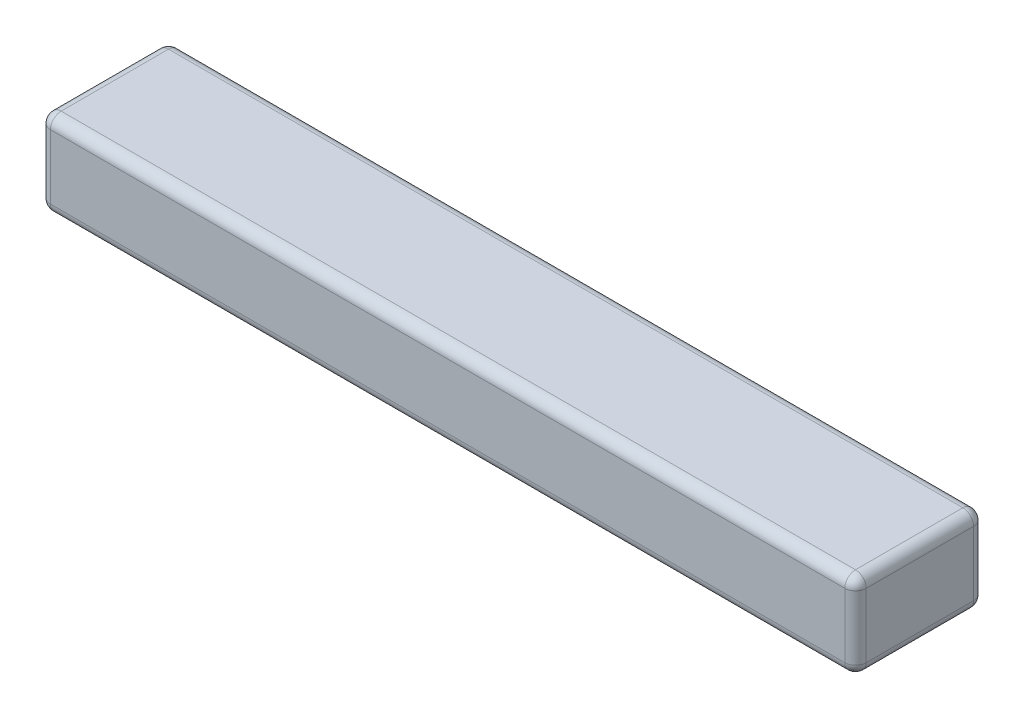
ISO-10303-21;
HEADER;
FILE_DESCRIPTION(('STEP AP214'),'2;1');
FILE_NAME('part.step','',(''),(''),'','','');
FILE_SCHEMA(('AUTOMOTIVE_DESIGN { 1 0 10303 214 1 1 1 1 }'));
ENDSEC;
DATA;
#1=APPLICATION_CONTEXT('core data for automotive mechanical design processes');
#2=APPLICATION_PROTOCOL_DEFINITION('international standard','automotive_design',2000,#1);
#3=PRODUCT_CONTEXT('',#1,'mechanical');
#4=PRODUCT('Part','Part','',(#3));
#5=PRODUCT_RELATED_PRODUCT_CATEGORY('part','',(#4));
#6=PRODUCT_DEFINITION_FORMATION('','',#4);
#7=PRODUCT_DEFINITION_CONTEXT('part definition',#1,'design');
#8=PRODUCT_DEFINITION('design','',#6,#7);
#9=PRODUCT_DEFINITION_SHAPE('','',#8);
#10=(LENGTH_UNIT() NAMED_UNIT(*) SI_UNIT(.MILLI.,.METRE.));
#11=(NAMED_UNIT(*) PLANE_ANGLE_UNIT() SI_UNIT($,.RADIAN.));
#12=(NAMED_UNIT(*) SI_UNIT($,.STERADIAN.) SOLID_ANGLE_UNIT());
#13=UNCERTAINTY_MEASURE_WITH_UNIT(LENGTH_MEASURE(1.E-05),#10,'distance_accuracy_value','');
#14=(GEOMETRIC_REPRESENTATION_CONTEXT(3) GLOBAL_UNCERTAINTY_ASSIGNED_CONTEXT((#13)) GLOBAL_UNIT_ASSIGNED_CONTEXT((#10,
#11,#12)) REPRESENTATION_CONTEXT('',''));
#15=CARTESIAN_POINT('',(0.,0.,0.));
#16=DIRECTION('',(0.,0.,1.));
#17=DIRECTION('',(1.,0.,0.));
#18=AXIS2_PLACEMENT_3D('',#15,#16,#17);
#19=CARTESIAN_POINT('',(190.,-20.,-30.));
#20=DIRECTION('',(0.,0.,1.));
#21=DIRECTION('',(1.,0.,0.));
#22=AXIS2_PLACEMENT_3D('',#19,#20,#21);
#23=PLANE('',#22);
#24=DIRECTION('',(0.,1.,0.));
#25=VECTOR('',#24,1.);
#26=CARTESIAN_POINT('',(185.,-20.,-30.));
#27=LINE('',#26,#25);
#28=CARTESIAN_POINT('',(185.,15.,-30.));
#29=VERTEX_POINT('',#28);
#30=CARTESIAN_POINT('',(185.,-15.,-30.));
#31=VERTEX_POINT('',#30);
#32=EDGE_CURVE('E175',#29,#31,#27,.F.);
#33=ORIENTED_EDGE('',*,*,#32,.T.);
#34=DIRECTION('',(-1.,0.,0.));
#35=VECTOR('',#34,1.);
#36=CARTESIAN_POINT('',(190.,-15.,-30.));
#37=LINE('',#36,#35);
#38=CARTESIAN_POINT('',(-185.,-15.,-30.));
#39=VERTEX_POINT('',#38);
#40=EDGE_CURVE('E180',#31,#39,#37,.T.);
#41=ORIENTED_EDGE('',*,*,#40,.T.);
#42=DIRECTION('',(0.,1.,0.));
#43=VECTOR('',#42,1.);
#44=CARTESIAN_POINT('',(-185.,20.,-30.));
#45=LINE('',#44,#43);
#46=CARTESIAN_POINT('',(-185.,15.,-30.));
#47=VERTEX_POINT('',#46);
#48=EDGE_CURVE('E177',#39,#47,#45,.T.);
#49=ORIENTED_EDGE('',*,*,#48,.T.);
#50=DIRECTION('',(-1.,0.,0.));
#51=VECTOR('',#50,1.);
#52=CARTESIAN_POINT('',(190.,15.,-30.));
#53=LINE('',#52,#51);
#54=EDGE_CURVE('E173',#47,#29,#53,.F.);
#55=ORIENTED_EDGE('',*,*,#54,.T.);
#56=EDGE_LOOP('',(#33,#41,#49,#55));
#57=FACE_BOUND('',#56,.T.);
#58=ADVANCED_FACE('F32',(#57),#23,.F.);
#59=CARTESIAN_POINT('',(190.,20.,30.));
#60=DIRECTION('',(0.,-1.,0.));
#61=DIRECTION('',(0.,0.,-1.));
#62=AXIS2_PLACEMENT_3D('',#59,#60,#61);
#63=PLANE('',#62);
#64=DIRECTION('',(0.,0.,1.));
#65=VECTOR('',#64,1.);
#66=CARTESIAN_POINT('',(185.,20.,30.));
#67=LINE('',#66,#65);
#68=CARTESIAN_POINT('',(185.,20.,25.));
#69=VERTEX_POINT('',#68);
#70=CARTESIAN_POINT('',(185.,20.,-25.));
#71=VERTEX_POINT('',#70);
#72=EDGE_CURVE('E184',#69,#71,#67,.F.);
#73=ORIENTED_EDGE('',*,*,#72,.T.);
#74=DIRECTION('',(-1.,0.,0.));
#75=VECTOR('',#74,1.);
#76=CARTESIAN_POINT('',(190.,20.,-25.));
#77=LINE('',#76,#75);
#78=CARTESIAN_POINT('',(-185.,20.,-25.));
#79=VERTEX_POINT('',#78);
#80=EDGE_CURVE('E189',#71,#79,#77,.T.);
#81=ORIENTED_EDGE('',*,*,#80,.T.);
#82=DIRECTION('',(0.,0.,1.));
#83=VECTOR('',#82,1.);
#84=CARTESIAN_POINT('',(-185.,20.,30.));
#85=LINE('',#84,#83);
#86=CARTESIAN_POINT('',(-185.,20.,25.));
#87=VERTEX_POINT('',#86);
#88=EDGE_CURVE('E186',#79,#87,#85,.T.);
#89=ORIENTED_EDGE('',*,*,#88,.T.);
#90=DIRECTION('',(-1.,0.,0.));
#91=VECTOR('',#90,1.);
#92=CARTESIAN_POINT('',(190.,20.,25.));
#93=LINE('',#92,#91);
#94=EDGE_CURVE('E182',#87,#69,#93,.F.);
#95=ORIENTED_EDGE('',*,*,#94,.T.);
#96=EDGE_LOOP('',(#73,#81,#89,#95));
#97=FACE_BOUND('',#96,.T.);
#98=ADVANCED_FACE('F286',(#97),#63,.F.);
#99=CARTESIAN_POINT('',(190.,-20.,30.));
#100=DIRECTION('',(0.,0.,-1.));
#101=DIRECTION('',(-1.,0.,0.));
#102=AXIS2_PLACEMENT_3D('',#99,#100,#101);
#103=PLANE('',#102);
#104=DIRECTION('',(0.,-1.,0.));
#105=VECTOR('',#104,1.);
#106=CARTESIAN_POINT('',(-185.,-20.,30.));
#107=LINE('',#106,#105);
#108=CARTESIAN_POINT('',(-185.,15.,30.));
#109=VERTEX_POINT('',#108);
#110=CARTESIAN_POINT('',(-185.,-15.,30.));
#111=VERTEX_POINT('',#110);
#112=EDGE_CURVE('E195',#109,#111,#107,.T.);
#113=ORIENTED_EDGE('',*,*,#112,.T.);
#114=DIRECTION('',(-1.,0.,0.));
#115=VECTOR('',#114,1.);
#116=CARTESIAN_POINT('',(190.,-15.,30.));
#117=LINE('',#116,#115);
#118=CARTESIAN_POINT('',(185.,-15.,30.));
#119=VERTEX_POINT('',#118);
#120=EDGE_CURVE('E198',#111,#119,#117,.F.);
#121=ORIENTED_EDGE('',*,*,#120,.T.);
#122=DIRECTION('',(0.,-1.,0.));
#123=VECTOR('',#122,1.);
#124=CARTESIAN_POINT('',(185.,-20.,30.));
#125=LINE('',#124,#123);
#126=CARTESIAN_POINT('',(185.,15.,30.));
#127=VERTEX_POINT('',#126);
#128=EDGE_CURVE('E193',#119,#127,#125,.F.);
#129=ORIENTED_EDGE('',*,*,#128,.T.);
#130=DIRECTION('',(-1.,0.,0.));
#131=VECTOR('',#130,1.);
#132=CARTESIAN_POINT('',(190.,15.,30.));
#133=LINE('',#132,#131);
#134=EDGE_CURVE('E191',#127,#109,#133,.T.);
#135=ORIENTED_EDGE('',*,*,#134,.T.);
#136=EDGE_LOOP('',(#113,#121,#129,#135));
#137=FACE_BOUND('',#136,.T.);
#138=ADVANCED_FACE('F306',(#137),#103,.F.);
#139=CARTESIAN_POINT('',(190.,-20.,30.));
#140=DIRECTION('',(0.,1.,0.));
#141=DIRECTION('',(0.,0.,1.));
#142=AXIS2_PLACEMENT_3D('',#139,#140,#141);
#143=PLANE('',#142);
#144=DIRECTION('',(0.,0.,-1.));
#145=VECTOR('',#144,1.);
#146=CARTESIAN_POINT('',(-185.,-20.,-30.));
#147=LINE('',#146,#145);
#148=CARTESIAN_POINT('',(-185.,-20.,25.));
#149=VERTEX_POINT('',#148);
#150=CARTESIAN_POINT('',(-185.,-20.,-25.));
#151=VERTEX_POINT('',#150);
#152=EDGE_CURVE('E135',#149,#151,#147,.T.);
#153=ORIENTED_EDGE('',*,*,#152,.T.);
#154=DIRECTION('',(-1.,0.,0.));
#155=VECTOR('',#154,1.);
#156=CARTESIAN_POINT('',(190.,-20.,-25.));
#157=LINE('',#156,#155);
#158=CARTESIAN_POINT('',(185.,-20.,-25.));
#159=VERTEX_POINT('',#158);
#160=EDGE_CURVE('E131',#151,#159,#157,.F.);
#161=ORIENTED_EDGE('',*,*,#160,.T.);
#162=DIRECTION('',(0.,0.,-1.));
#163=VECTOR('',#162,1.);
#164=CARTESIAN_POINT('',(185.,-20.,30.));
#165=LINE('',#164,#163);
#166=CARTESIAN_POINT('',(185.,-20.,25.));
#167=VERTEX_POINT('',#166);
#168=EDGE_CURVE('E123',#159,#167,#165,.F.);
#169=ORIENTED_EDGE('',*,*,#168,.T.);
#170=DIRECTION('',(-1.,0.,0.));
#171=VECTOR('',#170,1.);
#172=CARTESIAN_POINT('',(190.,-20.,25.));
#173=LINE('',#172,#171);
#174=EDGE_CURVE('E128',#167,#149,#173,.T.);
#175=ORIENTED_EDGE('',*,*,#174,.T.);
#176=EDGE_LOOP('',(#153,#161,#169,#175));
#177=FACE_BOUND('',#176,.T.);
#178=ADVANCED_FACE('F126',(#177),#143,.F.);
#179=CARTESIAN_POINT('',(190.,0.,0.));
#180=DIRECTION('',(-1.,0.,0.));
#181=DIRECTION('',(0.,0.,1.));
#182=AXIS2_PLACEMENT_3D('',#179,#180,#181);
#183=PLANE('',#182);
#184=DIRECTION('',(0.,0.,-1.));
#185=VECTOR('',#184,1.);
#186=CARTESIAN_POINT('',(190.,-15.,0.));
#187=LINE('',#186,#185);
#188=CARTESIAN_POINT('',(190.,-15.,25.));
#189=VERTEX_POINT('',#188);
#190=CARTESIAN_POINT('',(190.,-15.,-25.));
#191=VERTEX_POINT('',#190);
#192=EDGE_CURVE('E56',#189,#191,#187,.T.);
#193=ORIENTED_EDGE('',*,*,#192,.T.);
#194=DIRECTION('',(0.,1.,0.));
#195=VECTOR('',#194,1.);
#196=CARTESIAN_POINT('',(190.,0.,-25.));
#197=LINE('',#196,#195);
#198=CARTESIAN_POINT('',(190.,15.,-25.));
#199=VERTEX_POINT('',#198);
#200=EDGE_CURVE('E11',#191,#199,#197,.T.);
#201=ORIENTED_EDGE('',*,*,#200,.T.);
#202=DIRECTION('',(0.,0.,1.));
#203=VECTOR('',#202,1.);
#204=CARTESIAN_POINT('',(190.,15.,0.));
#205=LINE('',#204,#203);
#206=CARTESIAN_POINT('',(190.,15.,25.));
#207=VERTEX_POINT('',#206);
#208=EDGE_CURVE('E41',#199,#207,#205,.T.);
#209=ORIENTED_EDGE('',*,*,#208,.T.);
#210=DIRECTION('',(0.,-1.,0.));
#211=VECTOR('',#210,1.);
#212=CARTESIAN_POINT('',(190.,0.,25.));
#213=LINE('',#212,#211);
#214=EDGE_CURVE('E200',#207,#189,#213,.T.);
#215=ORIENTED_EDGE('',*,*,#214,.T.);
#216=EDGE_LOOP('',(#193,#201,#209,#215));
#217=FACE_BOUND('',#216,.T.);
#218=ADVANCED_FACE('F259',(#217),#183,.F.);
#219=CARTESIAN_POINT('',(-190.,0.,0.));
#220=DIRECTION('',(-1.,0.,0.));
#221=DIRECTION('',(0.,0.,1.));
#222=AXIS2_PLACEMENT_3D('',#219,#220,#221);
#223=PLANE('',#222);
#224=DIRECTION('',(0.,1.,0.));
#225=VECTOR('',#224,1.);
#226=CARTESIAN_POINT('',(-190.,-20.,-25.));
#227=LINE('',#226,#225);
#228=CARTESIAN_POINT('',(-190.,15.,-25.));
#229=VERTEX_POINT('',#228);
#230=CARTESIAN_POINT('',(-190.,-15.,-25.));
#231=VERTEX_POINT('',#230);
#232=EDGE_CURVE('E168',#229,#231,#227,.F.);
#233=ORIENTED_EDGE('',*,*,#232,.T.);
#234=DIRECTION('',(0.,0.,-1.));
#235=VECTOR('',#234,1.);
#236=CARTESIAN_POINT('',(-190.,-15.,30.));
#237=LINE('',#236,#235);
#238=CARTESIAN_POINT('',(-190.,-15.,25.));
#239=VERTEX_POINT('',#238);
#240=EDGE_CURVE('E170',#231,#239,#237,.F.);
#241=ORIENTED_EDGE('',*,*,#240,.T.);
#242=DIRECTION('',(0.,-1.,0.));
#243=VECTOR('',#242,1.);
#244=CARTESIAN_POINT('',(-190.,20.,25.));
#245=LINE('',#244,#243);
#246=CARTESIAN_POINT('',(-190.,15.,25.));
#247=VERTEX_POINT('',#246);
#248=EDGE_CURVE('E164',#239,#247,#245,.F.);
#249=ORIENTED_EDGE('',*,*,#248,.T.);
#250=DIRECTION('',(0.,0.,1.));
#251=VECTOR('',#250,1.);
#252=CARTESIAN_POINT('',(-190.,15.,-30.));
#253=LINE('',#252,#251);
#254=EDGE_CURVE('E166',#247,#229,#253,.F.);
#255=ORIENTED_EDGE('',*,*,#254,.T.);
#256=EDGE_LOOP('',(#233,#241,#249,#255));
#257=FACE_BOUND('',#256,.T.);
#258=ADVANCED_FACE('F339',(#257),#223,.T.);
#259=CARTESIAN_POINT('',(185.,15.,0.));
#260=DIRECTION('',(0.,0.,1.));
#261=DIRECTION('',(1.,0.,0.));
#262=AXIS2_PLACEMENT_3D('',#259,#260,#261);
#263=CYLINDRICAL_SURFACE('',#262,5.);
#264=CARTESIAN_POINT('',(185.,15.,25.));
#265=DIRECTION('',(0.,0.,1.));
#266=DIRECTION('',(1.,0.,0.));
#267=AXIS2_PLACEMENT_3D('',#264,#265,#266);
#268=CIRCLE('',#267,5.);
#269=EDGE_CURVE('E36',#207,#69,#268,.T.);
#270=ORIENTED_EDGE('',*,*,#269,.F.);
#271=ORIENTED_EDGE('',*,*,#208,.F.);
#272=CARTESIAN_POINT('',(185.,15.,-25.));
#273=DIRECTION('',(0.,0.,-1.));
#274=DIRECTION('',(-1.,0.,0.));
#275=AXIS2_PLACEMENT_3D('',#272,#273,#274);
#276=CIRCLE('',#275,5.);
#277=EDGE_CURVE('E160',#71,#199,#276,.T.);
#278=ORIENTED_EDGE('',*,*,#277,.F.);
#279=ORIENTED_EDGE('',*,*,#72,.F.);
#280=EDGE_LOOP('',(#270,#271,#278,#279));
#281=FACE_BOUND('',#280,.T.);
#282=ADVANCED_FACE('F34',(#281),#263,.T.);
#283=CARTESIAN_POINT('',(185.,15.,25.));
#284=DIRECTION('',(0.,0.,1.));
#285=DIRECTION('',(1.,0.,0.));
#286=AXIS2_PLACEMENT_3D('',#283,#284,#285);
#287=SPHERICAL_SURFACE('',#286,5.);
#288=CARTESIAN_POINT('',(185.,15.,25.));
#289=DIRECTION('',(0.,1.,0.));
#290=DIRECTION('',(-1.,0.,0.));
#291=AXIS2_PLACEMENT_3D('',#288,#289,#290);
#292=CIRCLE('',#291,5.);
#293=EDGE_CURVE('E244',#207,#127,#292,.F.);
#294=ORIENTED_EDGE('',*,*,#293,.F.);
#295=ORIENTED_EDGE('',*,*,#269,.T.);
#296=CARTESIAN_POINT('',(185.,15.,25.));
#297=DIRECTION('',(1.,0.,0.));
#298=DIRECTION('',(0.,0.,-1.));
#299=AXIS2_PLACEMENT_3D('',#296,#297,#298);
#300=CIRCLE('',#299,5.);
#301=EDGE_CURVE('E247',#127,#69,#300,.F.);
#302=ORIENTED_EDGE('',*,*,#301,.F.);
#303=EDGE_LOOP('',(#294,#295,#302));
#304=FACE_BOUND('',#303,.T.);
#305=ADVANCED_FACE('F300',(#304),#287,.T.);
#306=CARTESIAN_POINT('',(185.,15.,-25.));
#307=DIRECTION('',(0.,0.,1.));
#308=DIRECTION('',(1.,0.,0.));
#309=AXIS2_PLACEMENT_3D('',#306,#307,#308);
#310=SPHERICAL_SURFACE('',#309,5.);
#311=CARTESIAN_POINT('',(185.,15.,-25.));
#312=DIRECTION('',(1.,0.,0.));
#313=DIRECTION('',(0.,0.,-1.));
#314=AXIS2_PLACEMENT_3D('',#311,#312,#313);
#315=CIRCLE('',#314,5.);
#316=EDGE_CURVE('E240',#71,#29,#315,.F.);
#317=ORIENTED_EDGE('',*,*,#316,.F.);
#318=ORIENTED_EDGE('',*,*,#277,.T.);
#319=CARTESIAN_POINT('',(185.,15.,-25.));
#320=DIRECTION('',(0.,1.,0.));
#321=DIRECTION('',(0.,0.,1.));
#322=AXIS2_PLACEMENT_3D('',#319,#320,#321);
#323=CIRCLE('',#322,5.);
#324=EDGE_CURVE('E49',#29,#199,#323,.F.);
#325=ORIENTED_EDGE('',*,*,#324,.F.);
#326=EDGE_LOOP('',(#317,#318,#325));
#327=FACE_BOUND('',#326,.T.);
#328=ADVANCED_FACE('F253',(#327),#310,.T.);
#329=CARTESIAN_POINT('',(190.,15.,25.));
#330=DIRECTION('',(-1.,0.,0.));
#331=DIRECTION('',(0.,0.,1.));
#332=AXIS2_PLACEMENT_3D('',#329,#330,#331);
#333=CYLINDRICAL_SURFACE('',#332,5.);
#334=ORIENTED_EDGE('',*,*,#301,.T.);
#335=ORIENTED_EDGE('',*,*,#94,.F.);
#336=CARTESIAN_POINT('',(-185.,15.,25.));
#337=DIRECTION('',(-1.,0.,0.));
#338=DIRECTION('',(0.,0.,1.));
#339=AXIS2_PLACEMENT_3D('',#336,#337,#338);
#340=CIRCLE('',#339,5.);
#341=EDGE_CURVE('E235',#109,#87,#340,.T.);
#342=ORIENTED_EDGE('',*,*,#341,.F.);
#343=ORIENTED_EDGE('',*,*,#134,.F.);
#344=EDGE_LOOP('',(#334,#335,#342,#343));
#345=FACE_BOUND('',#344,.T.);
#346=ADVANCED_FACE('F296',(#345),#333,.T.);
#347=CARTESIAN_POINT('',(185.,0.,25.));
#348=DIRECTION('',(0.,-1.,0.));
#349=DIRECTION('',(0.,0.,-1.));
#350=AXIS2_PLACEMENT_3D('',#347,#348,#349);
#351=CYLINDRICAL_SURFACE('',#350,5.);
#352=ORIENTED_EDGE('',*,*,#293,.T.);
#353=ORIENTED_EDGE('',*,*,#128,.F.);
#354=CARTESIAN_POINT('',(185.,-15.,25.));
#355=DIRECTION('',(0.,-1.,0.));
#356=DIRECTION('',(0.,0.,-1.));
#357=AXIS2_PLACEMENT_3D('',#354,#355,#356);
#358=CIRCLE('',#357,5.);
#359=EDGE_CURVE('E144',#189,#119,#358,.T.);
#360=ORIENTED_EDGE('',*,*,#359,.F.);
#361=ORIENTED_EDGE('',*,*,#214,.F.);
#362=EDGE_LOOP('',(#352,#353,#360,#361));
#363=FACE_BOUND('',#362,.T.);
#364=ADVANCED_FACE('F304',(#363),#351,.T.);
#365=CARTESIAN_POINT('',(185.,-15.,0.));
#366=DIRECTION('',(0.,0.,-1.));
#367=DIRECTION('',(-1.,0.,0.));
#368=AXIS2_PLACEMENT_3D('',#365,#366,#367);
#369=CYLINDRICAL_SURFACE('',#368,5.);
#370=CARTESIAN_POINT('',(185.,-15.,-25.));
#371=DIRECTION('',(0.,0.,-1.));
#372=DIRECTION('',(-1.,0.,0.));
#373=AXIS2_PLACEMENT_3D('',#370,#371,#372);
#374=CIRCLE('',#373,5.);
#375=EDGE_CURVE('E145',#191,#159,#374,.T.);
#376=ORIENTED_EDGE('',*,*,#375,.F.);
#377=ORIENTED_EDGE('',*,*,#192,.F.);
#378=CARTESIAN_POINT('',(185.,-15.,25.));
#379=DIRECTION('',(0.,0.,1.));
#380=DIRECTION('',(1.,0.,0.));
#381=AXIS2_PLACEMENT_3D('',#378,#379,#380);
#382=CIRCLE('',#381,5.);
#383=EDGE_CURVE('E138',#167,#189,#382,.T.);
#384=ORIENTED_EDGE('',*,*,#383,.F.);
#385=ORIENTED_EDGE('',*,*,#168,.F.);
#386=EDGE_LOOP('',(#376,#377,#384,#385));
#387=FACE_BOUND('',#386,.T.);
#388=ADVANCED_FACE('F140',(#387),#369,.T.);
#389=CARTESIAN_POINT('',(185.,0.,-25.));
#390=DIRECTION('',(0.,1.,0.));
#391=DIRECTION('',(0.,0.,1.));
#392=AXIS2_PLACEMENT_3D('',#389,#390,#391);
#393=CYLINDRICAL_SURFACE('',#392,5.);
#394=ORIENTED_EDGE('',*,*,#324,.T.);
#395=ORIENTED_EDGE('',*,*,#200,.F.);
#396=CARTESIAN_POINT('',(185.,-15.,-25.));
#397=DIRECTION('',(0.,-1.,0.));
#398=DIRECTION('',(0.,0.,-1.));
#399=AXIS2_PLACEMENT_3D('',#396,#397,#398);
#400=CIRCLE('',#399,5.);
#401=EDGE_CURVE('E230',#31,#191,#400,.T.);
#402=ORIENTED_EDGE('',*,*,#401,.F.);
#403=ORIENTED_EDGE('',*,*,#32,.F.);
#404=EDGE_LOOP('',(#394,#395,#402,#403));
#405=FACE_BOUND('',#404,.T.);
#406=ADVANCED_FACE('F261',(#405),#393,.T.);
#407=CARTESIAN_POINT('',(190.,15.,-25.));
#408=DIRECTION('',(-1.,0.,0.));
#409=DIRECTION('',(0.,0.,1.));
#410=AXIS2_PLACEMENT_3D('',#407,#408,#409);
#411=CYLINDRICAL_SURFACE('',#410,5.);
#412=ORIENTED_EDGE('',*,*,#316,.T.);
#413=ORIENTED_EDGE('',*,*,#54,.F.);
#414=CARTESIAN_POINT('',(-185.,15.,-25.));
#415=DIRECTION('',(-1.,0.,0.));
#416=DIRECTION('',(0.,0.,1.));
#417=AXIS2_PLACEMENT_3D('',#414,#415,#416);
#418=CIRCLE('',#417,5.);
#419=EDGE_CURVE('E227',#79,#47,#418,.T.);
#420=ORIENTED_EDGE('',*,*,#419,.F.);
#421=ORIENTED_EDGE('',*,*,#80,.F.);
#422=EDGE_LOOP('',(#412,#413,#420,#421));
#423=FACE_BOUND('',#422,.T.);
#424=ADVANCED_FACE('F283',(#423),#411,.T.);
#425=CARTESIAN_POINT('',(-185.,15.,30.));
#426=DIRECTION('',(0.,0.,-1.));
#427=DIRECTION('',(-1.,0.,0.));
#428=AXIS2_PLACEMENT_3D('',#425,#426,#427);
#429=CYLINDRICAL_SURFACE('',#428,5.);
#430=CARTESIAN_POINT('',(-185.,15.,25.));
#431=DIRECTION('',(0.,0.,1.));
#432=DIRECTION('',(1.,0.,0.));
#433=AXIS2_PLACEMENT_3D('',#430,#431,#432);
#434=CIRCLE('',#433,5.);
#435=EDGE_CURVE('E237',#87,#247,#434,.T.);
#436=ORIENTED_EDGE('',*,*,#435,.F.);
#437=ORIENTED_EDGE('',*,*,#88,.F.);
#438=CARTESIAN_POINT('',(-185.,15.,-25.));
#439=DIRECTION('',(0.,0.,-1.));
#440=DIRECTION('',(0.,1.,0.));
#441=AXIS2_PLACEMENT_3D('',#438,#439,#440);
#442=CIRCLE('',#441,5.);
#443=EDGE_CURVE('E224',#229,#79,#442,.T.);
#444=ORIENTED_EDGE('',*,*,#443,.F.);
#445=ORIENTED_EDGE('',*,*,#254,.F.);
#446=EDGE_LOOP('',(#436,#437,#444,#445));
#447=FACE_BOUND('',#446,.T.);
#448=ADVANCED_FACE('F289',(#447),#429,.T.);
#449=CARTESIAN_POINT('',(-185.,15.,25.));
#450=DIRECTION('',(0.,0.,1.));
#451=DIRECTION('',(1.,0.,0.));
#452=AXIS2_PLACEMENT_3D('',#449,#450,#451);
#453=SPHERICAL_SURFACE('',#452,5.);
#454=ORIENTED_EDGE('',*,*,#341,.T.);
#455=ORIENTED_EDGE('',*,*,#435,.T.);
#456=CARTESIAN_POINT('',(-185.,15.,25.));
#457=DIRECTION('',(0.,1.,0.));
#458=DIRECTION('',(0.,0.,1.));
#459=AXIS2_PLACEMENT_3D('',#456,#457,#458);
#460=CIRCLE('',#459,5.);
#461=EDGE_CURVE('E152',#109,#247,#460,.F.);
#462=ORIENTED_EDGE('',*,*,#461,.F.);
#463=EDGE_LOOP('',(#454,#455,#462));
#464=FACE_BOUND('',#463,.T.);
#465=ADVANCED_FACE('F404',(#464),#453,.T.);
#466=CARTESIAN_POINT('',(185.,-15.,25.));
#467=DIRECTION('',(0.,0.,1.));
#468=DIRECTION('',(1.,0.,0.));
#469=AXIS2_PLACEMENT_3D('',#466,#467,#468);
#470=SPHERICAL_SURFACE('',#469,5.);
#471=ORIENTED_EDGE('',*,*,#383,.T.);
#472=ORIENTED_EDGE('',*,*,#359,.T.);
#473=CARTESIAN_POINT('',(185.,-15.,25.));
#474=DIRECTION('',(1.,0.,0.));
#475=DIRECTION('',(0.,0.,-1.));
#476=AXIS2_PLACEMENT_3D('',#473,#474,#475);
#477=CIRCLE('',#476,5.);
#478=EDGE_CURVE('E148',#167,#119,#477,.F.);
#479=ORIENTED_EDGE('',*,*,#478,.F.);
#480=EDGE_LOOP('',(#471,#472,#479));
#481=FACE_BOUND('',#480,.T.);
#482=ADVANCED_FACE('F149',(#481),#470,.T.);
#483=CARTESIAN_POINT('',(185.,-15.,-25.));
#484=DIRECTION('',(0.,0.,1.));
#485=DIRECTION('',(1.,0.,0.));
#486=AXIS2_PLACEMENT_3D('',#483,#484,#485);
#487=SPHERICAL_SURFACE('',#486,5.);
#488=ORIENTED_EDGE('',*,*,#401,.T.);
#489=ORIENTED_EDGE('',*,*,#375,.T.);
#490=CARTESIAN_POINT('',(185.,-15.,-25.));
#491=DIRECTION('',(1.,0.,0.));
#492=DIRECTION('',(0.,0.,-1.));
#493=AXIS2_PLACEMENT_3D('',#490,#491,#492);
#494=CIRCLE('',#493,5.);
#495=EDGE_CURVE('E153',#31,#159,#494,.F.);
#496=ORIENTED_EDGE('',*,*,#495,.F.);
#497=EDGE_LOOP('',(#488,#489,#496));
#498=FACE_BOUND('',#497,.T.);
#499=ADVANCED_FACE('F264',(#498),#487,.T.);
#500=CARTESIAN_POINT('',(-185.,15.,-25.));
#501=DIRECTION('',(0.,0.,1.));
#502=DIRECTION('',(1.,0.,0.));
#503=AXIS2_PLACEMENT_3D('',#500,#501,#502);
#504=SPHERICAL_SURFACE('',#503,5.);
#505=ORIENTED_EDGE('',*,*,#443,.T.);
#506=ORIENTED_EDGE('',*,*,#419,.T.);
#507=CARTESIAN_POINT('',(-185.,15.,-25.));
#508=DIRECTION('',(0.,1.,0.));
#509=DIRECTION('',(0.,0.,1.));
#510=AXIS2_PLACEMENT_3D('',#507,#508,#509);
#511=CIRCLE('',#510,5.);
#512=EDGE_CURVE('E218',#229,#47,#511,.F.);
#513=ORIENTED_EDGE('',*,*,#512,.F.);
#514=EDGE_LOOP('',(#505,#506,#513));
#515=FACE_BOUND('',#514,.T.);
#516=ADVANCED_FACE('F280',(#515),#504,.T.);
#517=CARTESIAN_POINT('',(-185.,-20.,25.));
#518=DIRECTION('',(0.,1.,0.));
#519=DIRECTION('',(0.,0.,1.));
#520=AXIS2_PLACEMENT_3D('',#517,#518,#519);
#521=CYLINDRICAL_SURFACE('',#520,5.);
#522=ORIENTED_EDGE('',*,*,#461,.T.);
#523=ORIENTED_EDGE('',*,*,#248,.F.);
#524=CARTESIAN_POINT('',(-185.,-15.,25.));
#525=DIRECTION('',(0.,-1.,0.));
#526=DIRECTION('',(0.,0.,-1.));
#527=AXIS2_PLACEMENT_3D('',#524,#525,#526);
#528=CIRCLE('',#527,5.);
#529=EDGE_CURVE('E215',#111,#239,#528,.T.);
#530=ORIENTED_EDGE('',*,*,#529,.F.);
#531=ORIENTED_EDGE('',*,*,#112,.F.);
#532=EDGE_LOOP('',(#522,#523,#530,#531));
#533=FACE_BOUND('',#532,.T.);
#534=ADVANCED_FACE('F310',(#533),#521,.T.);
#535=CARTESIAN_POINT('',(190.,-15.,25.));
#536=DIRECTION('',(-1.,0.,0.));
#537=DIRECTION('',(0.,0.,1.));
#538=AXIS2_PLACEMENT_3D('',#535,#536,#537);
#539=CYLINDRICAL_SURFACE('',#538,5.);
#540=ORIENTED_EDGE('',*,*,#478,.T.);
#541=ORIENTED_EDGE('',*,*,#120,.F.);
#542=CARTESIAN_POINT('',(-185.,-15.,25.));
#543=DIRECTION('',(-1.,0.,0.));
#544=DIRECTION('',(0.,0.,1.));
#545=AXIS2_PLACEMENT_3D('',#542,#543,#544);
#546=CIRCLE('',#545,5.);
#547=EDGE_CURVE('E156',#149,#111,#546,.T.);
#548=ORIENTED_EDGE('',*,*,#547,.F.);
#549=ORIENTED_EDGE('',*,*,#174,.F.);
#550=EDGE_LOOP('',(#540,#541,#548,#549));
#551=FACE_BOUND('',#550,.T.);
#552=ADVANCED_FACE('F155',(#551),#539,.T.);
#553=CARTESIAN_POINT('',(190.,-15.,-25.));
#554=DIRECTION('',(-1.,0.,0.));
#555=DIRECTION('',(0.,0.,1.));
#556=AXIS2_PLACEMENT_3D('',#553,#554,#555);
#557=CYLINDRICAL_SURFACE('',#556,5.);
#558=ORIENTED_EDGE('',*,*,#495,.T.);
#559=ORIENTED_EDGE('',*,*,#160,.F.);
#560=CARTESIAN_POINT('',(-185.,-15.,-25.));
#561=DIRECTION('',(-1.,0.,0.));
#562=DIRECTION('',(0.,0.,1.));
#563=AXIS2_PLACEMENT_3D('',#560,#561,#562);
#564=CIRCLE('',#563,5.);
#565=EDGE_CURVE('E211',#39,#151,#564,.T.);
#566=ORIENTED_EDGE('',*,*,#565,.F.);
#567=ORIENTED_EDGE('',*,*,#40,.F.);
#568=EDGE_LOOP('',(#558,#559,#566,#567));
#569=FACE_BOUND('',#568,.T.);
#570=ADVANCED_FACE('F268',(#569),#557,.T.);
#571=CARTESIAN_POINT('',(-185.,-20.,-25.));
#572=DIRECTION('',(0.,-1.,0.));
#573=DIRECTION('',(0.,0.,-1.));
#574=AXIS2_PLACEMENT_3D('',#571,#572,#573);
#575=CYLINDRICAL_SURFACE('',#574,5.);
#576=ORIENTED_EDGE('',*,*,#512,.T.);
#577=ORIENTED_EDGE('',*,*,#48,.F.);
#578=CARTESIAN_POINT('',(-185.,-15.,-25.));
#579=DIRECTION('',(0.,-1.,0.));
#580=DIRECTION('',(0.,0.,-1.));
#581=AXIS2_PLACEMENT_3D('',#578,#579,#580);
#582=CIRCLE('',#581,5.);
#583=EDGE_CURVE('E208',#231,#39,#582,.T.);
#584=ORIENTED_EDGE('',*,*,#583,.F.);
#585=ORIENTED_EDGE('',*,*,#232,.F.);
#586=EDGE_LOOP('',(#576,#577,#584,#585));
#587=FACE_BOUND('',#586,.T.);
#588=ADVANCED_FACE('F273',(#587),#575,.T.);
#589=CARTESIAN_POINT('',(-185.,-15.,25.));
#590=DIRECTION('',(0.,0.,1.));
#591=DIRECTION('',(1.,0.,0.));
#592=AXIS2_PLACEMENT_3D('',#589,#590,#591);
#593=SPHERICAL_SURFACE('',#592,5.);
#594=ORIENTED_EDGE('',*,*,#547,.T.);
#595=ORIENTED_EDGE('',*,*,#529,.T.);
#596=CARTESIAN_POINT('',(-185.,-15.,25.));
#597=DIRECTION('',(0.,0.,1.));
#598=DIRECTION('',(1.,0.,0.));
#599=AXIS2_PLACEMENT_3D('',#596,#597,#598);
#600=CIRCLE('',#599,5.);
#601=EDGE_CURVE('E206',#149,#239,#600,.F.);
#602=ORIENTED_EDGE('',*,*,#601,.F.);
#603=EDGE_LOOP('',(#594,#595,#602));
#604=FACE_BOUND('',#603,.T.);
#605=ADVANCED_FACE('F313',(#604),#593,.T.);
#606=CARTESIAN_POINT('',(-185.,-15.,-25.));
#607=DIRECTION('',(0.,0.,1.));
#608=DIRECTION('',(1.,0.,0.));
#609=AXIS2_PLACEMENT_3D('',#606,#607,#608);
#610=SPHERICAL_SURFACE('',#609,5.);
#611=ORIENTED_EDGE('',*,*,#583,.T.);
#612=ORIENTED_EDGE('',*,*,#565,.T.);
#613=CARTESIAN_POINT('',(-185.,-15.,-25.));
#614=DIRECTION('',(0.,0.,-1.));
#615=DIRECTION('',(-1.,0.,0.));
#616=AXIS2_PLACEMENT_3D('',#613,#614,#615);
#617=CIRCLE('',#616,5.);
#618=EDGE_CURVE('E204',#231,#151,#617,.F.);
#619=ORIENTED_EDGE('',*,*,#618,.F.);
#620=EDGE_LOOP('',(#611,#612,#619));
#621=FACE_BOUND('',#620,.T.);
#622=ADVANCED_FACE('F319',(#621),#610,.T.);
#623=CARTESIAN_POINT('',(-185.,-15.,30.));
#624=DIRECTION('',(0.,0.,1.));
#625=DIRECTION('',(1.,0.,0.));
#626=AXIS2_PLACEMENT_3D('',#623,#624,#625);
#627=CYLINDRICAL_SURFACE('',#626,5.);
#628=ORIENTED_EDGE('',*,*,#601,.T.);
#629=ORIENTED_EDGE('',*,*,#240,.F.);
#630=ORIENTED_EDGE('',*,*,#618,.T.);
#631=ORIENTED_EDGE('',*,*,#152,.F.);
#632=EDGE_LOOP('',(#628,#629,#630,#631));
#633=FACE_BOUND('',#632,.T.);
#634=ADVANCED_FACE('F316',(#633),#627,.T.);
#635=CLOSED_SHELL('',(#58,#98,#138,#178,#218,#258,#282,#305,#328,#346,#364,#388,#406,#424,#448,
#465,#482,#499,#516,#534,#552,#570,#588,#605,#622,#634));
#636=MANIFOLD_SOLID_BREP('B2',#635);
#637=ADVANCED_BREP_SHAPE_REPRESENTATION('',(#18,#636),#14);
#638=SHAPE_DEFINITION_REPRESENTATION(#9,#637);
ENDSEC;
END-ISO-10303-21;
